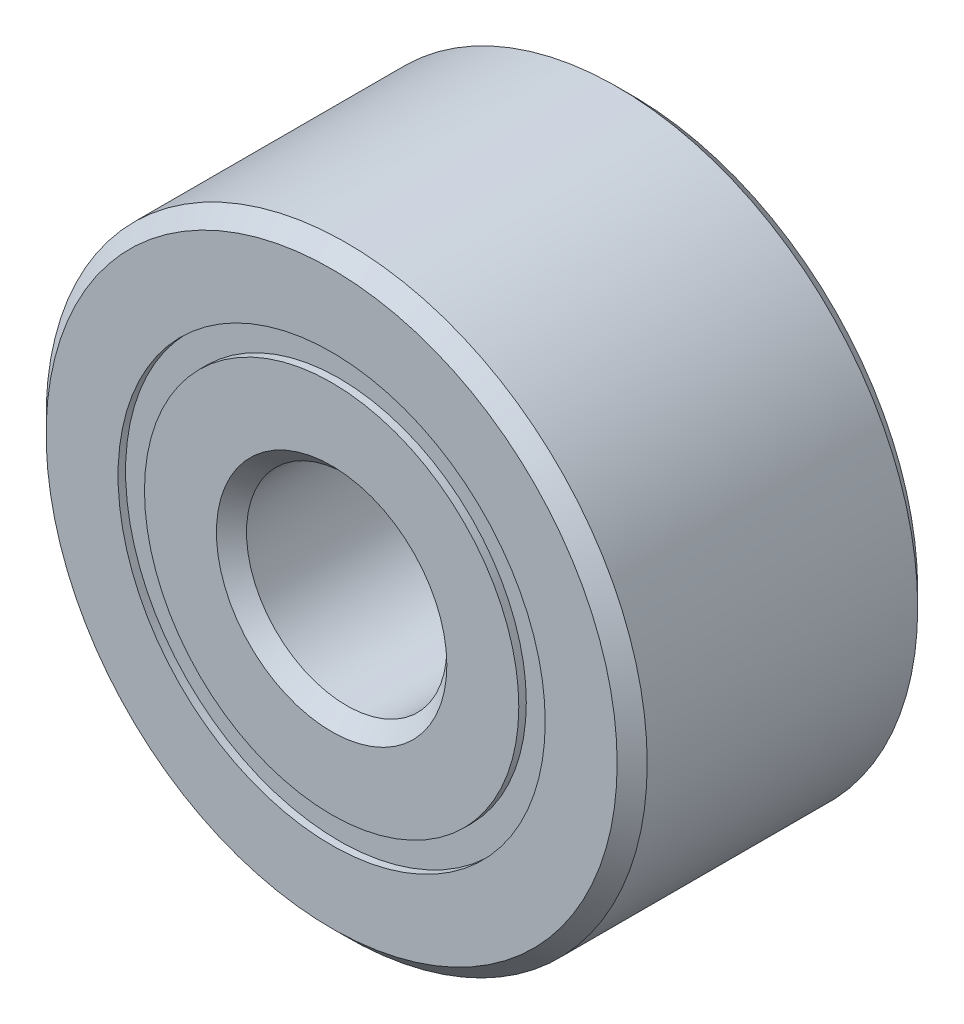
ISO-10303-21;
HEADER;
FILE_DESCRIPTION(('STEP AP214'),'2;1');
FILE_NAME('part.step','',(''),(''),'','','');
FILE_SCHEMA(('AUTOMOTIVE_DESIGN { 1 0 10303 214 1 1 1 1 }'));
ENDSEC;
DATA;
#1=APPLICATION_CONTEXT('core data for automotive mechanical design processes');
#2=APPLICATION_PROTOCOL_DEFINITION('international standard','automotive_design',2000,#1);
#3=PRODUCT_CONTEXT('',#1,'mechanical');
#4=PRODUCT('Part','Part','',(#3));
#5=PRODUCT_RELATED_PRODUCT_CATEGORY('part','',(#4));
#6=PRODUCT_DEFINITION_FORMATION('','',#4);
#7=PRODUCT_DEFINITION_CONTEXT('part definition',#1,'design');
#8=PRODUCT_DEFINITION('design','',#6,#7);
#9=PRODUCT_DEFINITION_SHAPE('','',#8);
#10=(LENGTH_UNIT() NAMED_UNIT(*) SI_UNIT(.MILLI.,.METRE.));
#11=(NAMED_UNIT(*) PLANE_ANGLE_UNIT() SI_UNIT($,.RADIAN.));
#12=(NAMED_UNIT(*) SI_UNIT($,.STERADIAN.) SOLID_ANGLE_UNIT());
#13=UNCERTAINTY_MEASURE_WITH_UNIT(LENGTH_MEASURE(1.E-05),#10,'distance_accuracy_value','');
#14=(GEOMETRIC_REPRESENTATION_CONTEXT(3) GLOBAL_UNCERTAINTY_ASSIGNED_CONTEXT((#13)) GLOBAL_UNIT_ASSIGNED_CONTEXT((#10,
#11,#12)) REPRESENTATION_CONTEXT('',''));
#15=CARTESIAN_POINT('',(0.,0.,0.));
#16=DIRECTION('',(0.,0.,1.));
#17=DIRECTION('',(1.,0.,0.));
#18=AXIS2_PLACEMENT_3D('',#15,#16,#17);
#19=CARTESIAN_POINT('',(0.,2.13186813186813,-1.425));
#20=DIRECTION('',(0.,0.,1.));
#21=DIRECTION('',(1.,0.,0.));
#22=AXIS2_PLACEMENT_3D('',#19,#20,#21);
#23=PLANE('',#22);
#24=CARTESIAN_POINT('',(0.,0.,-1.425));
#25=DIRECTION('',(0.,0.,1.));
#26=DIRECTION('',(1.,0.,0.));
#27=AXIS2_PLACEMENT_3D('',#24,#25,#26);
#28=CIRCLE('',#27,2.13186813186813);
#29=CARTESIAN_POINT('',(2.13186813186813,0.,-1.425));
#30=VERTEX_POINT('',#29);
#31=EDGE_CURVE('E55',#30,#30,#28,.T.);
#32=ORIENTED_EDGE('',*,*,#31,.F.);
#33=EDGE_LOOP('',(#32));
#34=FACE_BOUND('',#33,.T.);
#35=CARTESIAN_POINT('',(0.,0.,-1.425));
#36=DIRECTION('',(0.,0.,1.));
#37=DIRECTION('',(1.,0.,0.));
#38=AXIS2_PLACEMENT_3D('',#35,#36,#37);
#39=CIRCLE('',#38,1.86813186813187);
#40=CARTESIAN_POINT('',(1.86813186813187,0.,-1.425));
#41=VERTEX_POINT('',#40);
#42=EDGE_CURVE('E11',#41,#41,#39,.T.);
#43=ORIENTED_EDGE('',*,*,#42,.T.);
#44=EDGE_LOOP('',(#43));
#45=FACE_BOUND('',#44,.T.);
#46=ADVANCED_FACE('F41',(#34,#45),#23,.F.);
#47=CARTESIAN_POINT('',(0.,0.,1.5));
#48=DIRECTION('',(0.,0.,1.));
#49=DIRECTION('',(1.,0.,0.));
#50=AXIS2_PLACEMENT_3D('',#47,#48,#49);
#51=CYLINDRICAL_SURFACE('',#50,1.86813186813187);
#52=ORIENTED_EDGE('',*,*,#42,.F.);
#53=EDGE_LOOP('',(#52));
#54=FACE_BOUND('',#53,.T.);
#55=CARTESIAN_POINT('',(0.,0.,-0.679583437590143));
#56=DIRECTION('',(0.,0.,1.));
#57=DIRECTION('',(1.,0.,0.));
#58=AXIS2_PLACEMENT_3D('',#55,#56,#57);
#59=CIRCLE('',#58,1.86813186813187);
#60=CARTESIAN_POINT('',(1.86813186813187,0.,-0.679583437590143));
#61=VERTEX_POINT('',#60);
#62=EDGE_CURVE('E47',#61,#61,#59,.T.);
#63=ORIENTED_EDGE('',*,*,#62,.T.);
#64=EDGE_LOOP('',(#63));
#65=FACE_BOUND('',#64,.T.);
#66=ADVANCED_FACE('F64',(#54,#65),#51,.F.);
#67=CARTESIAN_POINT('',(0.,2.13186813186813,-0.679583437590143));
#68=DIRECTION('',(0.,0.,-1.));
#69=DIRECTION('',(-1.,0.,0.));
#70=AXIS2_PLACEMENT_3D('',#67,#68,#69);
#71=PLANE('',#70);
#72=ORIENTED_EDGE('',*,*,#62,.F.);
#73=EDGE_LOOP('',(#72));
#74=FACE_BOUND('',#73,.T.);
#75=CARTESIAN_POINT('',(0.,0.,-0.679583437590143));
#76=DIRECTION('',(0.,0.,1.));
#77=DIRECTION('',(1.,0.,0.));
#78=AXIS2_PLACEMENT_3D('',#75,#76,#77);
#79=CIRCLE('',#78,2.13186813186813);
#80=CARTESIAN_POINT('',(2.13186813186813,0.,-0.679583437590143));
#81=VERTEX_POINT('',#80);
#82=EDGE_CURVE('E51',#81,#81,#79,.T.);
#83=ORIENTED_EDGE('',*,*,#82,.T.);
#84=EDGE_LOOP('',(#83));
#85=FACE_BOUND('',#84,.T.);
#86=ADVANCED_FACE('F68',(#74,#85),#71,.F.);
#87=CARTESIAN_POINT('',(0.,0.,1.5));
#88=DIRECTION('',(0.,0.,1.));
#89=DIRECTION('',(1.,0.,0.));
#90=AXIS2_PLACEMENT_3D('',#87,#88,#89);
#91=CYLINDRICAL_SURFACE('',#90,2.13186813186813);
#92=ORIENTED_EDGE('',*,*,#82,.F.);
#93=EDGE_LOOP('',(#92));
#94=FACE_BOUND('',#93,.T.);
#95=ORIENTED_EDGE('',*,*,#31,.T.);
#96=EDGE_LOOP('',(#95));
#97=FACE_BOUND('',#96,.T.);
#98=ADVANCED_FACE('F61',(#94,#97),#91,.T.);
#99=CLOSED_SHELL('',(#46,#66,#86,#98));
#100=MANIFOLD_SOLID_BREP('B2',#99);
#101=CARTESIAN_POINT('',(0.,2.13186813186813,1.425));
#102=DIRECTION('',(0.,0.,-1.));
#103=DIRECTION('',(-1.,0.,0.));
#104=AXIS2_PLACEMENT_3D('',#101,#102,#103);
#105=PLANE('',#104);
#106=CARTESIAN_POINT('',(0.,0.,1.425));
#107=DIRECTION('',(0.,0.,1.));
#108=DIRECTION('',(1.,0.,0.));
#109=AXIS2_PLACEMENT_3D('',#106,#107,#108);
#110=CIRCLE('',#109,1.86813186813187);
#111=CARTESIAN_POINT('',(1.86813186813187,0.,1.425));
#112=VERTEX_POINT('',#111);
#113=EDGE_CURVE('E40',#112,#112,#110,.T.);
#114=ORIENTED_EDGE('',*,*,#113,.F.);
#115=EDGE_LOOP('',(#114));
#116=FACE_BOUND('',#115,.T.);
#117=CARTESIAN_POINT('',(0.,0.,1.425));
#118=DIRECTION('',(0.,0.,1.));
#119=DIRECTION('',(1.,0.,0.));
#120=AXIS2_PLACEMENT_3D('',#117,#118,#119);
#121=CIRCLE('',#120,2.13186813186813);
#122=CARTESIAN_POINT('',(2.13186813186813,0.,1.425));
#123=VERTEX_POINT('',#122);
#124=EDGE_CURVE('E122',#123,#123,#121,.T.);
#125=ORIENTED_EDGE('',*,*,#124,.T.);
#126=EDGE_LOOP('',(#125));
#127=FACE_BOUND('',#126,.T.);
#128=ADVANCED_FACE('F108',(#116,#127),#105,.F.);
#129=CARTESIAN_POINT('',(0.,0.,1.5));
#130=DIRECTION('',(0.,0.,1.));
#131=DIRECTION('',(1.,0.,0.));
#132=AXIS2_PLACEMENT_3D('',#129,#130,#131);
#133=CYLINDRICAL_SURFACE('',#132,1.86813186813187);
#134=CARTESIAN_POINT('',(0.,0.,0.679583437590143));
#135=DIRECTION('',(0.,0.,1.));
#136=DIRECTION('',(1.,0.,0.));
#137=AXIS2_PLACEMENT_3D('',#134,#135,#136);
#138=CIRCLE('',#137,1.86813186813187);
#139=CARTESIAN_POINT('',(1.86813186813187,0.,0.679583437590143));
#140=VERTEX_POINT('',#139);
#141=EDGE_CURVE('E114',#140,#140,#138,.T.);
#142=ORIENTED_EDGE('',*,*,#141,.F.);
#143=EDGE_LOOP('',(#142));
#144=FACE_BOUND('',#143,.T.);
#145=ORIENTED_EDGE('',*,*,#113,.T.);
#146=EDGE_LOOP('',(#145));
#147=FACE_BOUND('',#146,.T.);
#148=ADVANCED_FACE('F137',(#144,#147),#133,.F.);
#149=CARTESIAN_POINT('',(0.,2.13186813186813,0.679583437590143));
#150=DIRECTION('',(0.,0.,1.));
#151=DIRECTION('',(1.,0.,0.));
#152=AXIS2_PLACEMENT_3D('',#149,#150,#151);
#153=PLANE('',#152);
#154=CARTESIAN_POINT('',(0.,0.,0.679583437590143));
#155=DIRECTION('',(0.,0.,1.));
#156=DIRECTION('',(1.,0.,0.));
#157=AXIS2_PLACEMENT_3D('',#154,#155,#156);
#158=CIRCLE('',#157,2.13186813186813);
#159=CARTESIAN_POINT('',(2.13186813186813,0.,0.679583437590143));
#160=VERTEX_POINT('',#159);
#161=EDGE_CURVE('E118',#160,#160,#158,.T.);
#162=ORIENTED_EDGE('',*,*,#161,.F.);
#163=EDGE_LOOP('',(#162));
#164=FACE_BOUND('',#163,.T.);
#165=ORIENTED_EDGE('',*,*,#141,.T.);
#166=EDGE_LOOP('',(#165));
#167=FACE_BOUND('',#166,.T.);
#168=ADVANCED_FACE('F132',(#164,#167),#153,.F.);
#169=CARTESIAN_POINT('',(0.,0.,1.5));
#170=DIRECTION('',(0.,0.,1.));
#171=DIRECTION('',(1.,0.,0.));
#172=AXIS2_PLACEMENT_3D('',#169,#170,#171);
#173=CYLINDRICAL_SURFACE('',#172,2.13186813186813);
#174=ORIENTED_EDGE('',*,*,#124,.F.);
#175=EDGE_LOOP('',(#174));
#176=FACE_BOUND('',#175,.T.);
#177=ORIENTED_EDGE('',*,*,#161,.T.);
#178=EDGE_LOOP('',(#177));
#179=FACE_BOUND('',#178,.T.);
#180=ADVANCED_FACE('F129',(#176,#179),#173,.T.);
#181=CLOSED_SHELL('',(#128,#148,#168,#180));
#182=MANIFOLD_SOLID_BREP('B6',#181);
#183=CARTESIAN_POINT('',(-0.999999999999978,1.73205080756889,0.));
#184=DIRECTION('',(0.,0.,1.));
#185=DIRECTION('',(-0.499999999999989,0.866025403784445,0.));
#186=AXIS2_PLACEMENT_3D('',#183,#184,#185);
#187=SPHERICAL_SURFACE('',#186,0.679583437590143);
#188=CARTESIAN_POINT('',(-0.999999999999978,1.73205080756889,0.679583437590143));
#189=VERTEX_POINT('',#188);
#190=VERTEX_LOOP('',#189);
#191=FACE_BOUND('',#190,.T.);
#192=ADVANCED_FACE('F175',(#191),#187,.T.);
#193=CLOSED_SHELL('',(#192));
#194=MANIFOLD_SOLID_BREP('B35',#193);
#195=CARTESIAN_POINT('',(-1.73205080756887,1.00000000000002,0.));
#196=DIRECTION('',(0.,0.,1.));
#197=DIRECTION('',(-0.866025403784433,0.50000000000001,0.));
#198=AXIS2_PLACEMENT_3D('',#195,#196,#197);
#199=SPHERICAL_SURFACE('',#198,0.679583437590143);
#200=CARTESIAN_POINT('',(-1.73205080756887,1.00000000000002,0.679583437590143));
#201=VERTEX_POINT('',#200);
#202=VERTEX_LOOP('',#201);
#203=FACE_BOUND('',#202,.T.);
#204=ADVANCED_FACE('F195',(#203),#199,.T.);
#205=CLOSED_SHELL('',(#204));
#206=MANIFOLD_SOLID_BREP('B104',#205);
#207=CARTESIAN_POINT('',(-2.,0.,0.));
#208=DIRECTION('',(0.,0.,1.));
#209=DIRECTION('',(-1.,0.,0.));
#210=AXIS2_PLACEMENT_3D('',#207,#208,#209);
#211=SPHERICAL_SURFACE('',#210,0.679583437590143);
#212=CARTESIAN_POINT('',(-2.,0.,0.679583437590143));
#213=VERTEX_POINT('',#212);
#214=VERTEX_LOOP('',#213);
#215=FACE_BOUND('',#214,.T.);
#216=ADVANCED_FACE('F215',(#215),#211,.T.);
#217=CLOSED_SHELL('',(#216));
#218=MANIFOLD_SOLID_BREP('B171',#217);
#219=CARTESIAN_POINT('',(-1.73205080756889,-0.999999999999984,0.));
#220=DIRECTION('',(0.,0.,1.));
#221=DIRECTION('',(-0.866025403784443,-0.499999999999992,0.));
#222=AXIS2_PLACEMENT_3D('',#219,#220,#221);
#223=SPHERICAL_SURFACE('',#222,0.679583437590143);
#224=CARTESIAN_POINT('',(-1.73205080756889,-0.999999999999984,0.679583437590143));
#225=VERTEX_POINT('',#224);
#226=VERTEX_LOOP('',#225);
#227=FACE_BOUND('',#226,.T.);
#228=ADVANCED_FACE('F235',(#227),#223,.T.);
#229=CLOSED_SHELL('',(#228));
#230=MANIFOLD_SOLID_BREP('B191',#229);
#231=CARTESIAN_POINT('',(-1.00000000000001,-1.73205080756887,0.));
#232=DIRECTION('',(0.,0.,1.));
#233=DIRECTION('',(-0.500000000000007,-0.866025403784435,0.));
#234=AXIS2_PLACEMENT_3D('',#231,#232,#233);
#235=SPHERICAL_SURFACE('',#234,0.679583437590143);
#236=CARTESIAN_POINT('',(-1.00000000000001,-1.73205080756887,0.679583437590143));
#237=VERTEX_POINT('',#236);
#238=VERTEX_LOOP('',#237);
#239=FACE_BOUND('',#238,.T.);
#240=ADVANCED_FACE('F255',(#239),#235,.T.);
#241=CLOSED_SHELL('',(#240));
#242=MANIFOLD_SOLID_BREP('B211',#241);
#243=CARTESIAN_POINT('',(0.,-2.,0.));
#244=DIRECTION('',(0.,0.,1.));
#245=DIRECTION('',(0.,-1.,0.));
#246=AXIS2_PLACEMENT_3D('',#243,#244,#245);
#247=SPHERICAL_SURFACE('',#246,0.679583437590143);
#248=CARTESIAN_POINT('',(0.,-2.,0.679583437590143));
#249=VERTEX_POINT('',#248);
#250=VERTEX_LOOP('',#249);
#251=FACE_BOUND('',#250,.T.);
#252=ADVANCED_FACE('F275',(#251),#247,.T.);
#253=CLOSED_SHELL('',(#252));
#254=MANIFOLD_SOLID_BREP('B231',#253);
#255=CARTESIAN_POINT('',(0.99999999999999,-1.73205080756888,0.));
#256=DIRECTION('',(0.,0.,1.));
#257=DIRECTION('',(0.499999999999995,-0.866025403784442,0.));
#258=AXIS2_PLACEMENT_3D('',#255,#256,#257);
#259=SPHERICAL_SURFACE('',#258,0.679583437590143);
#260=CARTESIAN_POINT('',(0.99999999999999,-1.73205080756888,0.679583437590143));
#261=VERTEX_POINT('',#260);
#262=VERTEX_LOOP('',#261);
#263=FACE_BOUND('',#262,.T.);
#264=ADVANCED_FACE('F295',(#263),#259,.T.);
#265=CLOSED_SHELL('',(#264));
#266=MANIFOLD_SOLID_BREP('B251',#265);
#267=CARTESIAN_POINT('',(1.73205080756887,-1.00000000000001,0.));
#268=DIRECTION('',(0.,0.,1.));
#269=DIRECTION('',(0.866025403784436,-0.500000000000004,0.));
#270=AXIS2_PLACEMENT_3D('',#267,#268,#269);
#271=SPHERICAL_SURFACE('',#270,0.679583437590143);
#272=CARTESIAN_POINT('',(1.73205080756887,-1.00000000000001,0.679583437590143));
#273=VERTEX_POINT('',#272);
#274=VERTEX_LOOP('',#273);
#275=FACE_BOUND('',#274,.T.);
#276=ADVANCED_FACE('F315',(#275),#271,.T.);
#277=CLOSED_SHELL('',(#276));
#278=MANIFOLD_SOLID_BREP('B271',#277);
#279=CARTESIAN_POINT('',(2.,0.,0.));
#280=DIRECTION('',(0.,0.,1.));
#281=DIRECTION('',(1.,0.,0.));
#282=AXIS2_PLACEMENT_3D('',#279,#280,#281);
#283=SPHERICAL_SURFACE('',#282,0.679583437590143);
#284=CARTESIAN_POINT('',(2.,0.,0.679583437590143));
#285=VERTEX_POINT('',#284);
#286=VERTEX_LOOP('',#285);
#287=FACE_BOUND('',#286,.T.);
#288=ADVANCED_FACE('F335',(#287),#283,.T.);
#289=CLOSED_SHELL('',(#288));
#290=MANIFOLD_SOLID_BREP('B291',#289);
#291=CARTESIAN_POINT('',(1.73205080756888,0.999999999999996,0.));
#292=DIRECTION('',(0.,0.,1.));
#293=DIRECTION('',(0.86602540378444,0.499999999999998,0.));
#294=AXIS2_PLACEMENT_3D('',#291,#292,#293);
#295=SPHERICAL_SURFACE('',#294,0.679583437590143);
#296=CARTESIAN_POINT('',(1.73205080756888,0.999999999999996,0.679583437590143));
#297=VERTEX_POINT('',#296);
#298=VERTEX_LOOP('',#297);
#299=FACE_BOUND('',#298,.T.);
#300=ADVANCED_FACE('F355',(#299),#295,.T.);
#301=CLOSED_SHELL('',(#300));
#302=MANIFOLD_SOLID_BREP('B311',#301);
#303=CARTESIAN_POINT('',(1.,1.73205080756888,0.));
#304=DIRECTION('',(0.,0.,1.));
#305=DIRECTION('',(0.500000000000001,0.866025403784438,0.));
#306=AXIS2_PLACEMENT_3D('',#303,#304,#305);
#307=SPHERICAL_SURFACE('',#306,0.679583437590143);
#308=CARTESIAN_POINT('',(1.,1.73205080756888,0.679583437590143));
#309=VERTEX_POINT('',#308);
#310=VERTEX_LOOP('',#309);
#311=FACE_BOUND('',#310,.T.);
#312=ADVANCED_FACE('F375',(#311),#307,.T.);
#313=CLOSED_SHELL('',(#312));
#314=MANIFOLD_SOLID_BREP('B331',#313);
#315=CARTESIAN_POINT('',(0.,2.,0.));
#316=DIRECTION('',(0.,0.,1.));
#317=DIRECTION('',(0.,1.,0.));
#318=AXIS2_PLACEMENT_3D('',#315,#316,#317);
#319=SPHERICAL_SURFACE('',#318,0.679583437590143);
#320=CARTESIAN_POINT('',(0.,2.,0.679583437590143));
#321=VERTEX_POINT('',#320);
#322=VERTEX_LOOP('',#321);
#323=FACE_BOUND('',#322,.T.);
#324=ADVANCED_FACE('F397',(#323),#319,.T.);
#325=CLOSED_SHELL('',(#324));
#326=MANIFOLD_SOLID_BREP('B351',#325);
#327=CARTESIAN_POINT('',(0.,1.86813186813187,1.5));
#328=DIRECTION('',(0.,0.,-1.));
#329=DIRECTION('',(-1.,0.,0.));
#330=AXIS2_PLACEMENT_3D('',#327,#328,#329);
#331=PLANE('',#330);
#332=CARTESIAN_POINT('',(0.,0.,1.5));
#333=DIRECTION('',(0.,0.,1.));
#334=DIRECTION('',(1.,0.,0.));
#335=AXIS2_PLACEMENT_3D('',#332,#333,#334);
#336=CIRCLE('',#335,1.15);
#337=CARTESIAN_POINT('',(1.15,0.,1.5));
#338=VERTEX_POINT('',#337);
#339=EDGE_CURVE('E444',#338,#338,#336,.T.);
#340=ORIENTED_EDGE('',*,*,#339,.F.);
#341=EDGE_LOOP('',(#340));
#342=FACE_BOUND('',#341,.T.);
#343=CARTESIAN_POINT('',(0.,0.,1.5));
#344=DIRECTION('',(0.,0.,1.));
#345=DIRECTION('',(1.,0.,0.));
#346=AXIS2_PLACEMENT_3D('',#343,#344,#345);
#347=CIRCLE('',#346,1.86813186813187);
#348=CARTESIAN_POINT('',(1.86813186813187,0.,1.5));
#349=VERTEX_POINT('',#348);
#350=EDGE_CURVE('E396',#349,#349,#347,.T.);
#351=ORIENTED_EDGE('',*,*,#350,.T.);
#352=EDGE_LOOP('',(#351));
#353=FACE_BOUND('',#352,.T.);
#354=ADVANCED_FACE('F416',(#342,#353),#331,.F.);
#355=CARTESIAN_POINT('',(0.,0.,1.5));
#356=DIRECTION('',(0.,0.,1.));
#357=DIRECTION('',(1.,0.,0.));
#358=AXIS2_PLACEMENT_3D('',#355,#356,#357);
#359=CYLINDRICAL_SURFACE('',#358,1.86813186813187);
#360=ORIENTED_EDGE('',*,*,#350,.F.);
#361=EDGE_LOOP('',(#360));
#362=FACE_BOUND('',#361,.T.);
#363=CARTESIAN_POINT('',(0.,0.,0.666666666666667));
#364=DIRECTION('',(0.,0.,1.));
#365=DIRECTION('',(1.,0.,0.));
#366=AXIS2_PLACEMENT_3D('',#363,#364,#365);
#367=CIRCLE('',#366,1.86813186813187);
#368=CARTESIAN_POINT('',(1.86813186813187,0.,0.666666666666667));
#369=VERTEX_POINT('',#368);
#370=EDGE_CURVE('E422',#369,#369,#367,.T.);
#371=ORIENTED_EDGE('',*,*,#370,.T.);
#372=EDGE_LOOP('',(#371));
#373=FACE_BOUND('',#372,.T.);
#374=ADVANCED_FACE('F451',(#362,#373),#359,.T.);
#375=CARTESIAN_POINT('',(0.,0.,0.));
#376=DIRECTION('',(0.,0.,1.));
#377=DIRECTION('',(1.,0.,0.));
#378=AXIS2_PLACEMENT_3D('',#375,#376,#377);
#379=TOROIDAL_SURFACE('',#378,2.,0.679583437590142);
#380=ORIENTED_EDGE('',*,*,#370,.F.);
#381=EDGE_LOOP('',(#380));
#382=FACE_BOUND('',#381,.T.);
#383=CARTESIAN_POINT('',(0.,0.,-0.666666666666667));
#384=DIRECTION('',(0.,0.,1.));
#385=DIRECTION('',(1.,0.,0.));
#386=AXIS2_PLACEMENT_3D('',#383,#384,#385);
#387=CIRCLE('',#386,1.86813186813187);
#388=CARTESIAN_POINT('',(1.86813186813187,0.,-0.666666666666667));
#389=VERTEX_POINT('',#388);
#390=EDGE_CURVE('E426',#389,#389,#387,.T.);
#391=ORIENTED_EDGE('',*,*,#390,.T.);
#392=EDGE_LOOP('',(#391));
#393=FACE_BOUND('',#392,.T.);
#394=ADVANCED_FACE('F455',(#382,#393),#379,.F.);
#395=CARTESIAN_POINT('',(0.,0.,1.5));
#396=DIRECTION('',(0.,0.,1.));
#397=DIRECTION('',(1.,0.,0.));
#398=AXIS2_PLACEMENT_3D('',#395,#396,#397);
#399=CYLINDRICAL_SURFACE('',#398,1.86813186813187);
#400=ORIENTED_EDGE('',*,*,#390,.F.);
#401=EDGE_LOOP('',(#400));
#402=FACE_BOUND('',#401,.T.);
#403=CARTESIAN_POINT('',(0.,0.,-1.5));
#404=DIRECTION('',(0.,0.,1.));
#405=DIRECTION('',(1.,0.,0.));
#406=AXIS2_PLACEMENT_3D('',#403,#404,#405);
#407=CIRCLE('',#406,1.86813186813187);
#408=CARTESIAN_POINT('',(1.86813186813187,0.,-1.5));
#409=VERTEX_POINT('',#408);
#410=EDGE_CURVE('E430',#409,#409,#407,.T.);
#411=ORIENTED_EDGE('',*,*,#410,.T.);
#412=EDGE_LOOP('',(#411));
#413=FACE_BOUND('',#412,.T.);
#414=ADVANCED_FACE('F460',(#402,#413),#399,.T.);
#415=CARTESIAN_POINT('',(0.,1.15,-1.5));
#416=DIRECTION('',(0.,0.,1.));
#417=DIRECTION('',(1.,0.,0.));
#418=AXIS2_PLACEMENT_3D('',#415,#416,#417);
#419=PLANE('',#418);
#420=ORIENTED_EDGE('',*,*,#410,.F.);
#421=EDGE_LOOP('',(#420));
#422=FACE_BOUND('',#421,.T.);
#423=CARTESIAN_POINT('',(0.,0.,-1.5));
#424=DIRECTION('',(0.,0.,1.));
#425=DIRECTION('',(1.,0.,0.));
#426=AXIS2_PLACEMENT_3D('',#423,#424,#425);
#427=CIRCLE('',#426,1.15);
#428=CARTESIAN_POINT('',(1.15,0.,-1.5));
#429=VERTEX_POINT('',#428);
#430=EDGE_CURVE('E435',#429,#429,#427,.T.);
#431=ORIENTED_EDGE('',*,*,#430,.T.);
#432=EDGE_LOOP('',(#431));
#433=FACE_BOUND('',#432,.T.);
#434=ADVANCED_FACE('F466',(#422,#433),#419,.F.);
#435=CARTESIAN_POINT('',(0.,0.,-1.35));
#436=DIRECTION('',(0.,0.,-1.));
#437=DIRECTION('',(-1.,0.,0.));
#438=AXIS2_PLACEMENT_3D('',#435,#436,#437);
#439=CONICAL_SURFACE('',#438,1.,0.785398163397447);
#440=ORIENTED_EDGE('',*,*,#430,.F.);
#441=EDGE_LOOP('',(#440));
#442=FACE_BOUND('',#441,.T.);
#443=CARTESIAN_POINT('',(0.,0.,-1.35));
#444=DIRECTION('',(0.,0.,1.));
#445=DIRECTION('',(1.,0.,0.));
#446=AXIS2_PLACEMENT_3D('',#443,#444,#445);
#447=CIRCLE('',#446,1.);
#448=CARTESIAN_POINT('',(1.,0.,-1.35));
#449=VERTEX_POINT('',#448);
#450=EDGE_CURVE('E438',#449,#449,#447,.T.);
#451=ORIENTED_EDGE('',*,*,#450,.T.);
#452=EDGE_LOOP('',(#451));
#453=FACE_BOUND('',#452,.T.);
#454=ADVANCED_FACE('F470',(#442,#453),#439,.F.);
#455=CARTESIAN_POINT('',(0.,0.,1.5));
#456=DIRECTION('',(0.,0.,1.));
#457=DIRECTION('',(1.,0.,0.));
#458=AXIS2_PLACEMENT_3D('',#455,#456,#457);
#459=CYLINDRICAL_SURFACE('',#458,1.);
#460=ORIENTED_EDGE('',*,*,#450,.F.);
#461=EDGE_LOOP('',(#460));
#462=FACE_BOUND('',#461,.T.);
#463=CARTESIAN_POINT('',(0.,0.,1.35));
#464=DIRECTION('',(0.,0.,1.));
#465=DIRECTION('',(1.,0.,0.));
#466=AXIS2_PLACEMENT_3D('',#463,#464,#465);
#467=CIRCLE('',#466,1.);
#468=CARTESIAN_POINT('',(1.,0.,1.35));
#469=VERTEX_POINT('',#468);
#470=EDGE_CURVE('E441',#469,#469,#467,.T.);
#471=ORIENTED_EDGE('',*,*,#470,.T.);
#472=EDGE_LOOP('',(#471));
#473=FACE_BOUND('',#472,.T.);
#474=ADVANCED_FACE('F474',(#462,#473),#459,.F.);
#475=CARTESIAN_POINT('',(0.,0.,1.5));
#476=DIRECTION('',(0.,0.,1.));
#477=DIRECTION('',(1.,0.,0.));
#478=AXIS2_PLACEMENT_3D('',#475,#476,#477);
#479=CONICAL_SURFACE('',#478,1.15,0.78539816339745);
#480=ORIENTED_EDGE('',*,*,#470,.F.);
#481=EDGE_LOOP('',(#480));
#482=FACE_BOUND('',#481,.T.);
#483=ORIENTED_EDGE('',*,*,#339,.T.);
#484=EDGE_LOOP('',(#483));
#485=FACE_BOUND('',#484,.T.);
#486=ADVANCED_FACE('F448',(#482,#485),#479,.F.);
#487=CLOSED_SHELL('',(#354,#374,#394,#414,#434,#454,#474,#486));
#488=MANIFOLD_SOLID_BREP('B371',#487);
#489=CARTESIAN_POINT('',(0.,0.,1.35));
#490=DIRECTION('',(0.,0.,-1.));
#491=DIRECTION('',(-1.,0.,0.));
#492=AXIS2_PLACEMENT_3D('',#489,#490,#491);
#493=CONICAL_SURFACE('',#492,3.,0.785398163397447);
#494=CARTESIAN_POINT('',(0.,0.,1.5));
#495=DIRECTION('',(0.,0.,1.));
#496=DIRECTION('',(1.,0.,0.));
#497=AXIS2_PLACEMENT_3D('',#494,#495,#496);
#498=CIRCLE('',#497,2.85);
#499=CARTESIAN_POINT('',(2.85,0.,1.5));
#500=VERTEX_POINT('',#499);
#501=EDGE_CURVE('E565',#500,#500,#498,.T.);
#502=ORIENTED_EDGE('',*,*,#501,.F.);
#503=EDGE_LOOP('',(#502));
#504=FACE_BOUND('',#503,.T.);
#505=CARTESIAN_POINT('',(0.,0.,1.35));
#506=DIRECTION('',(0.,0.,1.));
#507=DIRECTION('',(1.,0.,0.));
#508=AXIS2_PLACEMENT_3D('',#505,#506,#507);
#509=CIRCLE('',#508,3.);
#510=CARTESIAN_POINT('',(3.,0.,1.35));
#511=VERTEX_POINT('',#510);
#512=EDGE_CURVE('E415',#511,#511,#509,.T.);
#513=ORIENTED_EDGE('',*,*,#512,.T.);
#514=EDGE_LOOP('',(#513));
#515=FACE_BOUND('',#514,.T.);
#516=ADVANCED_FACE('F537',(#504,#515),#493,.T.);
#517=CARTESIAN_POINT('',(0.,0.,1.5));
#518=DIRECTION('',(0.,0.,1.));
#519=DIRECTION('',(1.,0.,0.));
#520=AXIS2_PLACEMENT_3D('',#517,#518,#519);
#521=CYLINDRICAL_SURFACE('',#520,3.);
#522=ORIENTED_EDGE('',*,*,#512,.F.);
#523=EDGE_LOOP('',(#522));
#524=FACE_BOUND('',#523,.T.);
#525=CARTESIAN_POINT('',(0.,0.,-1.35));
#526=DIRECTION('',(0.,0.,1.));
#527=DIRECTION('',(1.,0.,0.));
#528=AXIS2_PLACEMENT_3D('',#525,#526,#527);
#529=CIRCLE('',#528,3.);
#530=CARTESIAN_POINT('',(3.,0.,-1.35));
#531=VERTEX_POINT('',#530);
#532=EDGE_CURVE('E543',#531,#531,#529,.T.);
#533=ORIENTED_EDGE('',*,*,#532,.T.);
#534=EDGE_LOOP('',(#533));
#535=FACE_BOUND('',#534,.T.);
#536=ADVANCED_FACE('F572',(#524,#535),#521,.T.);
#537=CARTESIAN_POINT('',(0.,0.,-1.5));
#538=DIRECTION('',(0.,0.,1.));
#539=DIRECTION('',(1.,0.,0.));
#540=AXIS2_PLACEMENT_3D('',#537,#538,#539);
#541=CONICAL_SURFACE('',#540,2.85,0.785398163397447);
#542=ORIENTED_EDGE('',*,*,#532,.F.);
#543=EDGE_LOOP('',(#542));
#544=FACE_BOUND('',#543,.T.);
#545=CARTESIAN_POINT('',(0.,0.,-1.5));
#546=DIRECTION('',(0.,0.,1.));
#547=DIRECTION('',(1.,0.,0.));
#548=AXIS2_PLACEMENT_3D('',#545,#546,#547);
#549=CIRCLE('',#548,2.85);
#550=CARTESIAN_POINT('',(2.85,0.,-1.5));
#551=VERTEX_POINT('',#550);
#552=EDGE_CURVE('E547',#551,#551,#549,.T.);
#553=ORIENTED_EDGE('',*,*,#552,.T.);
#554=EDGE_LOOP('',(#553));
#555=FACE_BOUND('',#554,.T.);
#556=ADVANCED_FACE('F576',(#544,#555),#541,.T.);
#557=CARTESIAN_POINT('',(0.,2.85,-1.5));
#558=DIRECTION('',(0.,0.,1.));
#559=DIRECTION('',(1.,0.,0.));
#560=AXIS2_PLACEMENT_3D('',#557,#558,#559);
#561=PLANE('',#560);
#562=ORIENTED_EDGE('',*,*,#552,.F.);
#563=EDGE_LOOP('',(#562));
#564=FACE_BOUND('',#563,.T.);
#565=CARTESIAN_POINT('',(0.,0.,-1.5));
#566=DIRECTION('',(0.,0.,1.));
#567=DIRECTION('',(1.,0.,0.));
#568=AXIS2_PLACEMENT_3D('',#565,#566,#567);
#569=CIRCLE('',#568,2.13186813186813);
#570=CARTESIAN_POINT('',(2.13186813186813,0.,-1.5));
#571=VERTEX_POINT('',#570);
#572=EDGE_CURVE('E551',#571,#571,#569,.T.);
#573=ORIENTED_EDGE('',*,*,#572,.T.);
#574=EDGE_LOOP('',(#573));
#575=FACE_BOUND('',#574,.T.);
#576=ADVANCED_FACE('F581',(#564,#575),#561,.F.);
#577=CARTESIAN_POINT('',(0.,0.,1.5));
#578=DIRECTION('',(0.,0.,1.));
#579=DIRECTION('',(1.,0.,0.));
#580=AXIS2_PLACEMENT_3D('',#577,#578,#579);
#581=CYLINDRICAL_SURFACE('',#580,2.13186813186813);
#582=ORIENTED_EDGE('',*,*,#572,.F.);
#583=EDGE_LOOP('',(#582));
#584=FACE_BOUND('',#583,.T.);
#585=CARTESIAN_POINT('',(0.,0.,-0.666666666666667));
#586=DIRECTION('',(0.,0.,1.));
#587=DIRECTION('',(1.,0.,0.));
#588=AXIS2_PLACEMENT_3D('',#585,#586,#587);
#589=CIRCLE('',#588,2.13186813186813);
#590=CARTESIAN_POINT('',(2.13186813186813,0.,-0.666666666666667));
#591=VERTEX_POINT('',#590);
#592=EDGE_CURVE('E556',#591,#591,#589,.T.);
#593=ORIENTED_EDGE('',*,*,#592,.T.);
#594=EDGE_LOOP('',(#593));
#595=FACE_BOUND('',#594,.T.);
#596=ADVANCED_FACE('F587',(#584,#595),#581,.F.);
#597=CARTESIAN_POINT('',(0.,0.,0.));
#598=DIRECTION('',(0.,0.,1.));
#599=DIRECTION('',(1.,0.,0.));
#600=AXIS2_PLACEMENT_3D('',#597,#598,#599);
#601=TOROIDAL_SURFACE('',#600,2.,0.679583437590143);
#602=ORIENTED_EDGE('',*,*,#592,.F.);
#603=EDGE_LOOP('',(#602));
#604=FACE_BOUND('',#603,.T.);
#605=CARTESIAN_POINT('',(0.,0.,0.666666666666667));
#606=DIRECTION('',(0.,0.,1.));
#607=DIRECTION('',(1.,0.,0.));
#608=AXIS2_PLACEMENT_3D('',#605,#606,#607);
#609=CIRCLE('',#608,2.13186813186813);
#610=CARTESIAN_POINT('',(2.13186813186813,0.,0.666666666666667));
#611=VERTEX_POINT('',#610);
#612=EDGE_CURVE('E559',#611,#611,#609,.T.);
#613=ORIENTED_EDGE('',*,*,#612,.T.);
#614=EDGE_LOOP('',(#613));
#615=FACE_BOUND('',#614,.T.);
#616=ADVANCED_FACE('F591',(#604,#615),#601,.F.);
#617=CARTESIAN_POINT('',(0.,0.,1.5));
#618=DIRECTION('',(0.,0.,1.));
#619=DIRECTION('',(1.,0.,0.));
#620=AXIS2_PLACEMENT_3D('',#617,#618,#619);
#621=CYLINDRICAL_SURFACE('',#620,2.13186813186813);
#622=ORIENTED_EDGE('',*,*,#612,.F.);
#623=EDGE_LOOP('',(#622));
#624=FACE_BOUND('',#623,.T.);
#625=CARTESIAN_POINT('',(0.,0.,1.5));
#626=DIRECTION('',(0.,0.,1.));
#627=DIRECTION('',(1.,0.,0.));
#628=AXIS2_PLACEMENT_3D('',#625,#626,#627);
#629=CIRCLE('',#628,2.13186813186813);
#630=CARTESIAN_POINT('',(2.13186813186813,0.,1.5));
#631=VERTEX_POINT('',#630);
#632=EDGE_CURVE('E562',#631,#631,#629,.T.);
#633=ORIENTED_EDGE('',*,*,#632,.T.);
#634=EDGE_LOOP('',(#633));
#635=FACE_BOUND('',#634,.T.);
#636=ADVANCED_FACE('F595',(#624,#635),#621,.F.);
#637=CARTESIAN_POINT('',(0.,2.85,1.5));
#638=DIRECTION('',(0.,0.,-1.));
#639=DIRECTION('',(-1.,0.,0.));
#640=AXIS2_PLACEMENT_3D('',#637,#638,#639);
#641=PLANE('',#640);
#642=ORIENTED_EDGE('',*,*,#632,.F.);
#643=EDGE_LOOP('',(#642));
#644=FACE_BOUND('',#643,.T.);
#645=ORIENTED_EDGE('',*,*,#501,.T.);
#646=EDGE_LOOP('',(#645));
#647=FACE_BOUND('',#646,.T.);
#648=ADVANCED_FACE('F569',(#644,#647),#641,.F.);
#649=CLOSED_SHELL('',(#516,#536,#556,#576,#596,#616,#636,#648));
#650=MANIFOLD_SOLID_BREP('B391',#649);
#651=ADVANCED_BREP_SHAPE_REPRESENTATION('',(#18,#100,#182,#194,#206,#218,#230,#242,#254,#266,
#278,#290,#302,#314,#326,#488,#650),#14);
#652=SHAPE_DEFINITION_REPRESENTATION(#9,#651);
ENDSEC;
END-ISO-10303-21;
